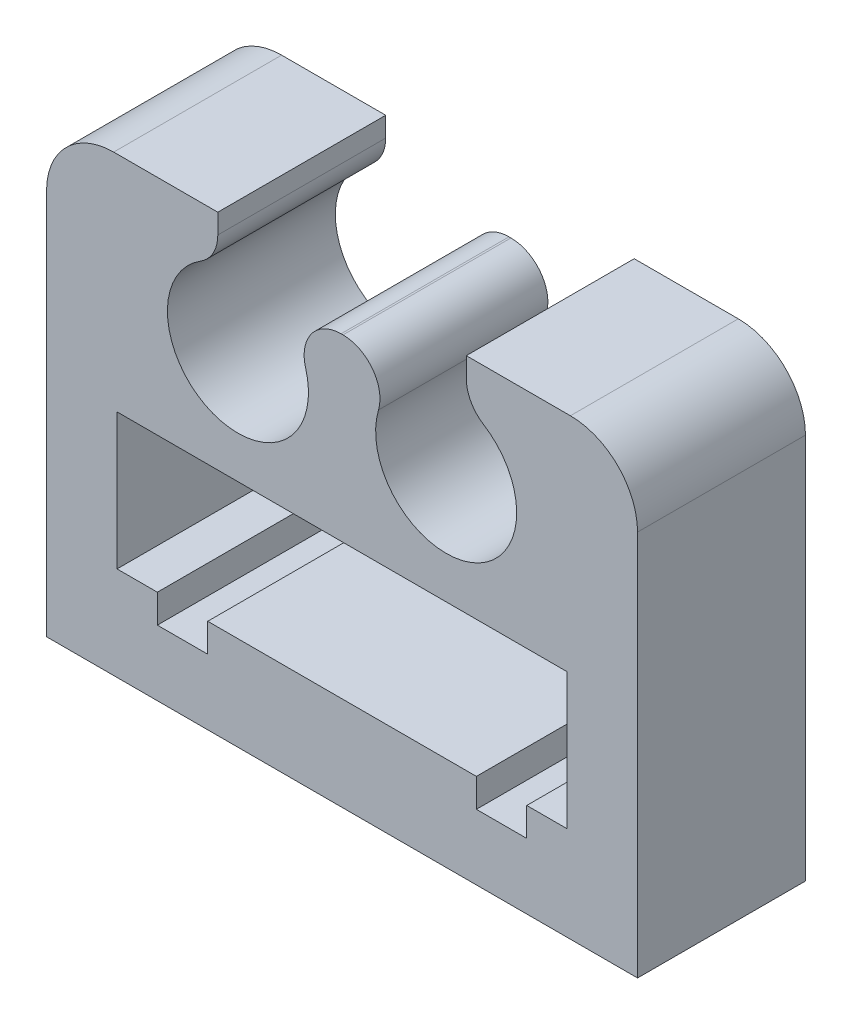
ISO-10303-21;
HEADER;
FILE_DESCRIPTION(('STEP AP214'),'2;1');
FILE_NAME('part.step','',(''),(''),'','','');
FILE_SCHEMA(('AUTOMOTIVE_DESIGN { 1 0 10303 214 1 1 1 1 }'));
ENDSEC;
DATA;
#1=APPLICATION_CONTEXT('core data for automotive mechanical design processes');
#2=APPLICATION_PROTOCOL_DEFINITION('international standard','automotive_design',2000,#1);
#3=PRODUCT_CONTEXT('',#1,'mechanical');
#4=PRODUCT('Part','Part','',(#3));
#5=PRODUCT_RELATED_PRODUCT_CATEGORY('part','',(#4));
#6=PRODUCT_DEFINITION_FORMATION('','',#4);
#7=PRODUCT_DEFINITION_CONTEXT('part definition',#1,'design');
#8=PRODUCT_DEFINITION('design','',#6,#7);
#9=PRODUCT_DEFINITION_SHAPE('','',#8);
#10=(LENGTH_UNIT() NAMED_UNIT(*) SI_UNIT(.MILLI.,.METRE.));
#11=(NAMED_UNIT(*) PLANE_ANGLE_UNIT() SI_UNIT($,.RADIAN.));
#12=(NAMED_UNIT(*) SI_UNIT($,.STERADIAN.) SOLID_ANGLE_UNIT());
#13=UNCERTAINTY_MEASURE_WITH_UNIT(LENGTH_MEASURE(1.E-05),#10,'distance_accuracy_value','');
#14=(GEOMETRIC_REPRESENTATION_CONTEXT(3) GLOBAL_UNCERTAINTY_ASSIGNED_CONTEXT((#13)) GLOBAL_UNIT_ASSIGNED_CONTEXT((#10,
#11,#12)) REPRESENTATION_CONTEXT('',''));
#15=CARTESIAN_POINT('',(0.,0.,0.));
#16=DIRECTION('',(0.,0.,1.));
#17=DIRECTION('',(1.,0.,0.));
#18=AXIS2_PLACEMENT_3D('',#15,#16,#17);
#19=CARTESIAN_POINT('',(0.,13.5,5.));
#20=DIRECTION('',(0.,-1.,0.));
#21=DIRECTION('',(0.,0.,-1.));
#22=AXIS2_PLACEMENT_3D('',#19,#20,#21);
#23=PLANE('',#22);
#24=DIRECTION('',(-1.,0.,0.));
#25=VECTOR('',#24,1.);
#26=CARTESIAN_POINT('',(0.,13.5,5.));
#27=LINE('',#26,#25);
#28=CARTESIAN_POINT('',(15.6,13.5,5.));
#29=VERTEX_POINT('',#28);
#30=CARTESIAN_POINT('',(12.5,13.5,5.));
#31=VERTEX_POINT('',#30);
#32=EDGE_CURVE('E419',#29,#31,#27,.T.);
#33=ORIENTED_EDGE('',*,*,#32,.F.);
#34=DIRECTION('',(0.,0.,-1.));
#35=VECTOR('',#34,1.);
#36=CARTESIAN_POINT('',(15.6,13.5,5.));
#37=LINE('',#36,#35);
#38=CARTESIAN_POINT('',(15.6,13.5,0.));
#39=VERTEX_POINT('',#38);
#40=EDGE_CURVE('E278',#29,#39,#37,.T.);
#41=ORIENTED_EDGE('',*,*,#40,.T.);
#42=DIRECTION('',(-1.,0.,0.));
#43=VECTOR('',#42,1.);
#44=CARTESIAN_POINT('',(0.,13.5,0.));
#45=LINE('',#44,#43);
#46=CARTESIAN_POINT('',(12.5,13.5,0.));
#47=VERTEX_POINT('',#46);
#48=EDGE_CURVE('E273',#39,#47,#45,.T.);
#49=ORIENTED_EDGE('',*,*,#48,.T.);
#50=DIRECTION('',(0.,0.,1.));
#51=VECTOR('',#50,1.);
#52=CARTESIAN_POINT('',(12.5,13.5,0.));
#53=LINE('',#52,#51);
#54=EDGE_CURVE('E276',#47,#31,#53,.T.);
#55=ORIENTED_EDGE('',*,*,#54,.T.);
#56=EDGE_LOOP('',(#33,#41,#49,#55));
#57=FACE_BOUND('',#56,.T.);
#58=ADVANCED_FACE('F87',(#57),#23,.F.);
#59=CARTESIAN_POINT('',(0.,0.,5.));
#60=DIRECTION('',(1.,0.,0.));
#61=DIRECTION('',(0.,0.,-1.));
#62=AXIS2_PLACEMENT_3D('',#59,#60,#61);
#63=PLANE('',#62);
#64=DIRECTION('',(0.,-1.,0.));
#65=VECTOR('',#64,1.);
#66=CARTESIAN_POINT('',(0.,0.,5.));
#67=LINE('',#66,#65);
#68=CARTESIAN_POINT('',(0.,11.5,5.));
#69=VERTEX_POINT('',#68);
#70=CARTESIAN_POINT('',(0.,0.,5.));
#71=VERTEX_POINT('',#70);
#72=EDGE_CURVE('E281',#69,#71,#67,.T.);
#73=ORIENTED_EDGE('',*,*,#72,.F.);
#74=DIRECTION('',(0.,0.,-1.));
#75=VECTOR('',#74,1.);
#76=CARTESIAN_POINT('',(0.,11.5,5.));
#77=LINE('',#76,#75);
#78=CARTESIAN_POINT('',(0.,11.5,0.));
#79=VERTEX_POINT('',#78);
#80=EDGE_CURVE('E95',#69,#79,#77,.T.);
#81=ORIENTED_EDGE('',*,*,#80,.T.);
#82=DIRECTION('',(0.,-1.,0.));
#83=VECTOR('',#82,1.);
#84=CARTESIAN_POINT('',(0.,0.,0.));
#85=LINE('',#84,#83);
#86=CARTESIAN_POINT('',(0.,0.,0.));
#87=VERTEX_POINT('',#86);
#88=EDGE_CURVE('E389',#79,#87,#85,.T.);
#89=ORIENTED_EDGE('',*,*,#88,.T.);
#90=DIRECTION('',(0.,0.,-1.));
#91=VECTOR('',#90,1.);
#92=CARTESIAN_POINT('',(0.,0.,5.));
#93=LINE('',#92,#91);
#94=EDGE_CURVE('E430',#71,#87,#93,.T.);
#95=ORIENTED_EDGE('',*,*,#94,.F.);
#96=EDGE_LOOP('',(#73,#81,#89,#95));
#97=FACE_BOUND('',#96,.T.);
#98=ADVANCED_FACE('F480',(#97),#63,.F.);
#99=CARTESIAN_POINT('',(0.,0.,5.));
#100=DIRECTION('',(0.,1.,0.));
#101=DIRECTION('',(0.,0.,1.));
#102=AXIS2_PLACEMENT_3D('',#99,#100,#101);
#103=PLANE('',#102);
#104=DIRECTION('',(1.,0.,0.));
#105=VECTOR('',#104,1.);
#106=CARTESIAN_POINT('',(0.,0.,0.));
#107=LINE('',#106,#105);
#108=CARTESIAN_POINT('',(17.6,0.,0.));
#109=VERTEX_POINT('',#108);
#110=EDGE_CURVE('E423',#87,#109,#107,.T.);
#111=ORIENTED_EDGE('',*,*,#110,.T.);
#112=DIRECTION('',(0.,0.,-1.));
#113=VECTOR('',#112,1.);
#114=CARTESIAN_POINT('',(17.6,0.,5.));
#115=LINE('',#114,#113);
#116=CARTESIAN_POINT('',(17.6,0.,5.));
#117=VERTEX_POINT('',#116);
#118=EDGE_CURVE('E421',#117,#109,#115,.T.);
#119=ORIENTED_EDGE('',*,*,#118,.F.);
#120=DIRECTION('',(1.,0.,0.));
#121=VECTOR('',#120,1.);
#122=CARTESIAN_POINT('',(0.,0.,5.));
#123=LINE('',#122,#121);
#124=EDGE_CURVE('E413',#71,#117,#123,.T.);
#125=ORIENTED_EDGE('',*,*,#124,.F.);
#126=ORIENTED_EDGE('',*,*,#94,.T.);
#127=EDGE_LOOP('',(#111,#119,#125,#126));
#128=FACE_BOUND('',#127,.T.);
#129=ADVANCED_FACE('F489',(#128),#103,.F.);
#130=CARTESIAN_POINT('',(17.6,0.,5.));
#131=DIRECTION('',(-1.,0.,0.));
#132=DIRECTION('',(0.,0.,1.));
#133=AXIS2_PLACEMENT_3D('',#130,#131,#132);
#134=PLANE('',#133);
#135=DIRECTION('',(0.,1.,0.));
#136=VECTOR('',#135,1.);
#137=CARTESIAN_POINT('',(17.6,0.,0.));
#138=LINE('',#137,#136);
#139=CARTESIAN_POINT('',(17.6,11.5,0.));
#140=VERTEX_POINT('',#139);
#141=EDGE_CURVE('E425',#109,#140,#138,.T.);
#142=ORIENTED_EDGE('',*,*,#141,.T.);
#143=DIRECTION('',(0.,0.,-1.));
#144=VECTOR('',#143,1.);
#145=CARTESIAN_POINT('',(17.6,11.5,5.));
#146=LINE('',#145,#144);
#147=CARTESIAN_POINT('',(17.6,11.5,5.));
#148=VERTEX_POINT('',#147);
#149=EDGE_CURVE('E472',#140,#148,#146,.F.);
#150=ORIENTED_EDGE('',*,*,#149,.T.);
#151=DIRECTION('',(0.,1.,0.));
#152=VECTOR('',#151,1.);
#153=CARTESIAN_POINT('',(17.6,0.,5.));
#154=LINE('',#153,#152);
#155=EDGE_CURVE('E415',#117,#148,#154,.T.);
#156=ORIENTED_EDGE('',*,*,#155,.F.);
#157=ORIENTED_EDGE('',*,*,#118,.T.);
#158=EDGE_LOOP('',(#142,#150,#156,#157));
#159=FACE_BOUND('',#158,.T.);
#160=ADVANCED_FACE('F498',(#159),#134,.F.);
#161=CARTESIAN_POINT('',(5.1,13.5,0.));
#162=VERTEX_POINT('',#161);
#163=CARTESIAN_POINT('',(2.,13.5,0.));
#164=VERTEX_POINT('',#163);
#165=EDGE_CURVE('E282',#162,#164,#45,.T.);
#166=ORIENTED_EDGE('',*,*,#165,.T.);
#167=DIRECTION('',(0.,0.,-1.));
#168=VECTOR('',#167,1.);
#169=CARTESIAN_POINT('',(2.,13.5,5.));
#170=LINE('',#169,#168);
#171=CARTESIAN_POINT('',(2.,13.5,5.));
#172=VERTEX_POINT('',#171);
#173=EDGE_CURVE('E12',#164,#172,#170,.F.);
#174=ORIENTED_EDGE('',*,*,#173,.T.);
#175=CARTESIAN_POINT('',(5.1,13.5,5.));
#176=VERTEX_POINT('',#175);
#177=EDGE_CURVE('E418',#176,#172,#27,.T.);
#178=ORIENTED_EDGE('',*,*,#177,.F.);
#179=DIRECTION('',(0.,0.,1.));
#180=VECTOR('',#179,1.);
#181=CARTESIAN_POINT('',(5.1,13.5,0.));
#182=LINE('',#181,#180);
#183=EDGE_CURVE('E294',#162,#176,#182,.T.);
#184=ORIENTED_EDGE('',*,*,#183,.F.);
#185=EDGE_LOOP('',(#166,#174,#178,#184));
#186=FACE_BOUND('',#185,.T.);
#187=ADVANCED_FACE('F500',(#186),#23,.F.);
#188=CARTESIAN_POINT('',(0.,0.,5.));
#189=DIRECTION('',(0.,0.,-1.));
#190=DIRECTION('',(-1.,0.,0.));
#191=AXIS2_PLACEMENT_3D('',#188,#189,#190);
#192=PLANE('',#191);
#193=ORIENTED_EDGE('',*,*,#155,.T.);
#194=CARTESIAN_POINT('',(15.6,11.5,5.));
#195=DIRECTION('',(0.,0.,-1.));
#196=DIRECTION('',(-1.,0.,0.));
#197=AXIS2_PLACEMENT_3D('',#194,#195,#196);
#198=CIRCLE('',#197,2.);
#199=EDGE_CURVE('E475',#148,#29,#198,.F.);
#200=ORIENTED_EDGE('',*,*,#199,.T.);
#201=ORIENTED_EDGE('',*,*,#32,.T.);
#202=DIRECTION('',(0.,-1.,0.));
#203=VECTOR('',#202,1.);
#204=CARTESIAN_POINT('',(12.5,13.5,5.));
#205=LINE('',#204,#203);
#206=CARTESIAN_POINT('',(12.5,12.9110883423452,5.));
#207=VERTEX_POINT('',#206);
#208=EDGE_CURVE('E292',#31,#207,#205,.T.);
#209=ORIENTED_EDGE('',*,*,#208,.T.);
#210=CARTESIAN_POINT('',(13.6,12.9110883423452,5.));
#211=DIRECTION('',(0.,0.,-1.));
#212=DIRECTION('',(-1.,0.,0.));
#213=AXIS2_PLACEMENT_3D('',#210,#211,#212);
#214=CIRCLE('',#213,1.1);
#215=CARTESIAN_POINT('',(13.015625,11.979151724664,5.));
#216=VERTEX_POINT('',#215);
#217=EDGE_CURVE('E441',#207,#216,#214,.F.);
#218=ORIENTED_EDGE('',*,*,#217,.T.);
#219=CARTESIAN_POINT('',(11.9,10.2,5.));
#220=DIRECTION('',(0.,0.,-1.));
#221=DIRECTION('',(-1.,0.,0.));
#222=AXIS2_PLACEMENT_3D('',#219,#220,#221);
#223=CIRCLE('',#222,2.1);
#224=CARTESIAN_POINT('',(9.88476748007209,10.790625,5.));
#225=VERTEX_POINT('',#224);
#226=EDGE_CURVE('E322',#216,#225,#223,.T.);
#227=ORIENTED_EDGE('',*,*,#226,.T.);
#228=CARTESIAN_POINT('',(8.82916949344318,11.1,5.));
#229=DIRECTION('',(0.,0.,-1.));
#230=DIRECTION('',(-1.,0.,0.));
#231=AXIS2_PLACEMENT_3D('',#228,#229,#230);
#232=CIRCLE('',#231,1.1);
#233=CARTESIAN_POINT('',(8.82916949344318,12.2,5.));
#234=VERTEX_POINT('',#233);
#235=EDGE_CURVE('E437',#225,#234,#232,.F.);
#236=ORIENTED_EDGE('',*,*,#235,.T.);
#237=DIRECTION('',(1.,0.,0.));
#238=VECTOR('',#237,1.);
#239=CARTESIAN_POINT('',(5.1,12.2,5.));
#240=LINE('',#239,#238);
#241=CARTESIAN_POINT('',(8.77083050655682,12.2,5.));
#242=VERTEX_POINT('',#241);
#243=EDGE_CURVE('E308',#242,#234,#240,.T.);
#244=ORIENTED_EDGE('',*,*,#243,.F.);
#245=CARTESIAN_POINT('',(8.77083050655682,11.1,5.));
#246=DIRECTION('',(0.,0.,-1.));
#247=DIRECTION('',(-1.,0.,0.));
#248=AXIS2_PLACEMENT_3D('',#245,#246,#247);
#249=CIRCLE('',#248,1.1);
#250=CARTESIAN_POINT('',(7.71523251992791,10.790625,5.));
#251=VERTEX_POINT('',#250);
#252=EDGE_CURVE('E435',#242,#251,#249,.F.);
#253=ORIENTED_EDGE('',*,*,#252,.T.);
#254=CARTESIAN_POINT('',(5.7,10.2,5.));
#255=DIRECTION('',(0.,0.,1.));
#256=DIRECTION('',(1.,0.,0.));
#257=AXIS2_PLACEMENT_3D('',#254,#255,#256);
#258=CIRCLE('',#257,2.1);
#259=CARTESIAN_POINT('',(4.584375,11.979151724664,5.));
#260=VERTEX_POINT('',#259);
#261=EDGE_CURVE('E293',#260,#251,#258,.T.);
#262=ORIENTED_EDGE('',*,*,#261,.F.);
#263=CARTESIAN_POINT('',(4.,12.9110883423452,5.));
#264=DIRECTION('',(0.,0.,-1.));
#265=DIRECTION('',(-1.,0.,0.));
#266=AXIS2_PLACEMENT_3D('',#263,#264,#265);
#267=CIRCLE('',#266,1.1);
#268=CARTESIAN_POINT('',(5.1,12.9110883423452,5.));
#269=VERTEX_POINT('',#268);
#270=EDGE_CURVE('E439',#260,#269,#267,.F.);
#271=ORIENTED_EDGE('',*,*,#270,.T.);
#272=DIRECTION('',(0.,-1.,0.));
#273=VECTOR('',#272,1.);
#274=CARTESIAN_POINT('',(5.1,13.5,5.));
#275=LINE('',#274,#273);
#276=EDGE_CURVE('E302',#176,#269,#275,.T.);
#277=ORIENTED_EDGE('',*,*,#276,.F.);
#278=ORIENTED_EDGE('',*,*,#177,.T.);
#279=CARTESIAN_POINT('',(2.,11.5,5.));
#280=DIRECTION('',(0.,0.,-1.));
#281=DIRECTION('',(-1.,0.,0.));
#282=AXIS2_PLACEMENT_3D('',#279,#280,#281);
#283=CIRCLE('',#282,2.);
#284=EDGE_CURVE('E102',#172,#69,#283,.F.);
#285=ORIENTED_EDGE('',*,*,#284,.T.);
#286=ORIENTED_EDGE('',*,*,#72,.T.);
#287=ORIENTED_EDGE('',*,*,#124,.T.);
#288=EDGE_LOOP('',(#193,#200,#201,#209,#218,#227,#236,#244,#253,#262,#271,#277,#278,#285,#286,#287));
#289=FACE_BOUND('',#288,.T.);
#290=DIRECTION('',(1.,0.,0.));
#291=VECTOR('',#290,1.);
#292=CARTESIAN_POINT('',(2.1,6.85,5.));
#293=LINE('',#292,#291);
#294=CARTESIAN_POINT('',(2.1,6.85,5.));
#295=VERTEX_POINT('',#294);
#296=CARTESIAN_POINT('',(15.5,6.85,5.));
#297=VERTEX_POINT('',#296);
#298=EDGE_CURVE('E342',#295,#297,#293,.T.);
#299=ORIENTED_EDGE('',*,*,#298,.T.);
#300=DIRECTION('',(0.,1.,0.));
#301=VECTOR('',#300,1.);
#302=CARTESIAN_POINT('',(15.5,2.8,5.));
#303=LINE('',#302,#301);
#304=CARTESIAN_POINT('',(15.5,2.8,5.));
#305=VERTEX_POINT('',#304);
#306=EDGE_CURVE('E346',#305,#297,#303,.T.);
#307=ORIENTED_EDGE('',*,*,#306,.F.);
#308=DIRECTION('',(1.,0.,0.));
#309=VECTOR('',#308,1.);
#310=CARTESIAN_POINT('',(2.1,2.8,5.));
#311=LINE('',#310,#309);
#312=CARTESIAN_POINT('',(14.3,2.8,5.));
#313=VERTEX_POINT('',#312);
#314=EDGE_CURVE('E349',#313,#305,#311,.T.);
#315=ORIENTED_EDGE('',*,*,#314,.F.);
#316=DIRECTION('',(0.,-1.,0.));
#317=VECTOR('',#316,1.);
#318=CARTESIAN_POINT('',(14.3,2.8,5.));
#319=LINE('',#318,#317);
#320=CARTESIAN_POINT('',(14.3,1.95,5.));
#321=VERTEX_POINT('',#320);
#322=EDGE_CURVE('E394',#313,#321,#319,.T.);
#323=ORIENTED_EDGE('',*,*,#322,.T.);
#324=DIRECTION('',(-1.,0.,0.));
#325=VECTOR('',#324,1.);
#326=CARTESIAN_POINT('',(14.3,1.95,5.));
#327=LINE('',#326,#325);
#328=CARTESIAN_POINT('',(12.8,1.95,5.));
#329=VERTEX_POINT('',#328);
#330=EDGE_CURVE('E402',#321,#329,#327,.T.);
#331=ORIENTED_EDGE('',*,*,#330,.T.);
#332=DIRECTION('',(0.,-1.,0.));
#333=VECTOR('',#332,1.);
#334=CARTESIAN_POINT('',(12.8,2.8,5.));
#335=LINE('',#334,#333);
#336=CARTESIAN_POINT('',(12.8,2.8,5.));
#337=VERTEX_POINT('',#336);
#338=EDGE_CURVE('E399',#337,#329,#335,.T.);
#339=ORIENTED_EDGE('',*,*,#338,.F.);
#340=CARTESIAN_POINT('',(4.8,2.8,5.));
#341=VERTEX_POINT('',#340);
#342=EDGE_CURVE('E352',#341,#337,#311,.T.);
#343=ORIENTED_EDGE('',*,*,#342,.F.);
#344=DIRECTION('',(0.,-1.,0.));
#345=VECTOR('',#344,1.);
#346=CARTESIAN_POINT('',(4.8,2.8,5.));
#347=LINE('',#346,#345);
#348=CARTESIAN_POINT('',(4.8,1.95,5.));
#349=VERTEX_POINT('',#348);
#350=EDGE_CURVE('E373',#341,#349,#347,.T.);
#351=ORIENTED_EDGE('',*,*,#350,.T.);
#352=DIRECTION('',(1.,0.,0.));
#353=VECTOR('',#352,1.);
#354=CARTESIAN_POINT('',(3.3,1.95,5.));
#355=LINE('',#354,#353);
#356=CARTESIAN_POINT('',(3.3,1.95,5.));
#357=VERTEX_POINT('',#356);
#358=EDGE_CURVE('E376',#357,#349,#355,.T.);
#359=ORIENTED_EDGE('',*,*,#358,.F.);
#360=DIRECTION('',(0.,-1.,0.));
#361=VECTOR('',#360,1.);
#362=CARTESIAN_POINT('',(3.3,2.8,5.));
#363=LINE('',#362,#361);
#364=CARTESIAN_POINT('',(3.3,2.8,5.));
#365=VERTEX_POINT('',#364);
#366=EDGE_CURVE('E366',#365,#357,#363,.T.);
#367=ORIENTED_EDGE('',*,*,#366,.F.);
#368=CARTESIAN_POINT('',(2.1,2.8,5.));
#369=VERTEX_POINT('',#368);
#370=EDGE_CURVE('E328',#369,#365,#311,.T.);
#371=ORIENTED_EDGE('',*,*,#370,.F.);
#372=DIRECTION('',(0.,1.,0.));
#373=VECTOR('',#372,1.);
#374=CARTESIAN_POINT('',(2.1,2.8,5.));
#375=LINE('',#374,#373);
#376=EDGE_CURVE('E339',#369,#295,#375,.T.);
#377=ORIENTED_EDGE('',*,*,#376,.T.);
#378=EDGE_LOOP('',(#299,#307,#315,#323,#331,#339,#343,#351,#359,#367,#371,#377));
#379=FACE_BOUND('',#378,.T.);
#380=ADVANCED_FACE('F491',(#289,#379),#192,.F.);
#381=CARTESIAN_POINT('',(0.,0.,0.));
#382=DIRECTION('',(0.,0.,-1.));
#383=DIRECTION('',(-1.,0.,0.));
#384=AXIS2_PLACEMENT_3D('',#381,#382,#383);
#385=PLANE('',#384);
#386=ORIENTED_EDGE('',*,*,#48,.F.);
#387=CARTESIAN_POINT('',(15.6,11.5,0.));
#388=DIRECTION('',(0.,0.,-1.));
#389=DIRECTION('',(-1.,0.,0.));
#390=AXIS2_PLACEMENT_3D('',#387,#388,#389);
#391=CIRCLE('',#390,2.);
#392=EDGE_CURVE('E470',#39,#140,#391,.T.);
#393=ORIENTED_EDGE('',*,*,#392,.T.);
#394=ORIENTED_EDGE('',*,*,#141,.F.);
#395=ORIENTED_EDGE('',*,*,#110,.F.);
#396=ORIENTED_EDGE('',*,*,#88,.F.);
#397=CARTESIAN_POINT('',(2.,11.5,0.));
#398=DIRECTION('',(0.,0.,-1.));
#399=DIRECTION('',(-1.,0.,0.));
#400=AXIS2_PLACEMENT_3D('',#397,#398,#399);
#401=CIRCLE('',#400,2.);
#402=EDGE_CURVE('E468',#79,#164,#401,.T.);
#403=ORIENTED_EDGE('',*,*,#402,.T.);
#404=ORIENTED_EDGE('',*,*,#165,.F.);
#405=DIRECTION('',(0.,-1.,0.));
#406=VECTOR('',#405,1.);
#407=CARTESIAN_POINT('',(5.1,13.5,0.));
#408=LINE('',#407,#406);
#409=CARTESIAN_POINT('',(5.1,12.9110883423452,0.));
#410=VERTEX_POINT('',#409);
#411=EDGE_CURVE('E305',#162,#410,#408,.T.);
#412=ORIENTED_EDGE('',*,*,#411,.T.);
#413=CARTESIAN_POINT('',(4.,12.9110883423452,0.));
#414=DIRECTION('',(0.,0.,-1.));
#415=DIRECTION('',(-1.,0.,0.));
#416=AXIS2_PLACEMENT_3D('',#413,#414,#415);
#417=CIRCLE('',#416,1.1);
#418=CARTESIAN_POINT('',(4.584375,11.979151724664,0.));
#419=VERTEX_POINT('',#418);
#420=EDGE_CURVE('E452',#410,#419,#417,.T.);
#421=ORIENTED_EDGE('',*,*,#420,.T.);
#422=CARTESIAN_POINT('',(5.7,10.2,0.));
#423=DIRECTION('',(0.,0.,1.));
#424=DIRECTION('',(1.,0.,0.));
#425=AXIS2_PLACEMENT_3D('',#422,#423,#424);
#426=CIRCLE('',#425,2.1);
#427=CARTESIAN_POINT('',(7.71523251992791,10.790625,0.));
#428=VERTEX_POINT('',#427);
#429=EDGE_CURVE('E403',#419,#428,#426,.T.);
#430=ORIENTED_EDGE('',*,*,#429,.T.);
#431=CARTESIAN_POINT('',(8.77083050655682,11.1,0.));
#432=DIRECTION('',(0.,0.,-1.));
#433=DIRECTION('',(-1.,0.,0.));
#434=AXIS2_PLACEMENT_3D('',#431,#432,#433);
#435=CIRCLE('',#434,1.1);
#436=CARTESIAN_POINT('',(8.77083050655682,12.2,0.));
#437=VERTEX_POINT('',#436);
#438=EDGE_CURVE('E448',#428,#437,#435,.T.);
#439=ORIENTED_EDGE('',*,*,#438,.T.);
#440=DIRECTION('',(1.,0.,0.));
#441=VECTOR('',#440,1.);
#442=CARTESIAN_POINT('',(5.1,12.2,0.));
#443=LINE('',#442,#441);
#444=CARTESIAN_POINT('',(8.82916949344318,12.2,0.));
#445=VERTEX_POINT('',#444);
#446=EDGE_CURVE('E301',#437,#445,#443,.T.);
#447=ORIENTED_EDGE('',*,*,#446,.T.);
#448=CARTESIAN_POINT('',(8.82916949344318,11.1,0.));
#449=DIRECTION('',(0.,0.,-1.));
#450=DIRECTION('',(-1.,0.,0.));
#451=AXIS2_PLACEMENT_3D('',#448,#449,#450);
#452=CIRCLE('',#451,1.1);
#453=CARTESIAN_POINT('',(9.88476748007209,10.790625,0.));
#454=VERTEX_POINT('',#453);
#455=EDGE_CURVE('E450',#445,#454,#452,.T.);
#456=ORIENTED_EDGE('',*,*,#455,.T.);
#457=CARTESIAN_POINT('',(11.9,10.2,0.));
#458=DIRECTION('',(0.,0.,-1.));
#459=DIRECTION('',(-1.,0.,0.));
#460=AXIS2_PLACEMENT_3D('',#457,#458,#459);
#461=CIRCLE('',#460,2.1);
#462=CARTESIAN_POINT('',(13.015625,11.979151724664,0.));
#463=VERTEX_POINT('',#462);
#464=EDGE_CURVE('E316',#463,#454,#461,.T.);
#465=ORIENTED_EDGE('',*,*,#464,.F.);
#466=CARTESIAN_POINT('',(13.6,12.9110883423452,0.));
#467=DIRECTION('',(0.,0.,-1.));
#468=DIRECTION('',(-1.,0.,0.));
#469=AXIS2_PLACEMENT_3D('',#466,#467,#468);
#470=CIRCLE('',#469,1.1);
#471=CARTESIAN_POINT('',(12.5,12.9110883423452,0.));
#472=VERTEX_POINT('',#471);
#473=EDGE_CURVE('E300',#463,#472,#470,.T.);
#474=ORIENTED_EDGE('',*,*,#473,.T.);
#475=DIRECTION('',(0.,-1.,0.));
#476=VECTOR('',#475,1.);
#477=CARTESIAN_POINT('',(12.5,13.5,0.));
#478=LINE('',#477,#476);
#479=EDGE_CURVE('E289',#47,#472,#478,.T.);
#480=ORIENTED_EDGE('',*,*,#479,.F.);
#481=EDGE_LOOP('',(#386,#393,#394,#395,#396,#403,#404,#412,#421,#430,#439,#447,#456,#465,#474,#480));
#482=FACE_BOUND('',#481,.T.);
#483=DIRECTION('',(0.,1.,0.));
#484=VECTOR('',#483,1.);
#485=CARTESIAN_POINT('',(15.5,2.8,0.));
#486=LINE('',#485,#484);
#487=CARTESIAN_POINT('',(15.5,2.8,0.));
#488=VERTEX_POINT('',#487);
#489=CARTESIAN_POINT('',(15.5,6.85,0.));
#490=VERTEX_POINT('',#489);
#491=EDGE_CURVE('E330',#488,#490,#486,.T.);
#492=ORIENTED_EDGE('',*,*,#491,.T.);
#493=DIRECTION('',(1.,0.,0.));
#494=VECTOR('',#493,1.);
#495=CARTESIAN_POINT('',(2.1,6.85,0.));
#496=LINE('',#495,#494);
#497=CARTESIAN_POINT('',(2.1,6.85,0.));
#498=VERTEX_POINT('',#497);
#499=EDGE_CURVE('E327',#498,#490,#496,.T.);
#500=ORIENTED_EDGE('',*,*,#499,.F.);
#501=DIRECTION('',(0.,1.,0.));
#502=VECTOR('',#501,1.);
#503=CARTESIAN_POINT('',(2.1,2.8,0.));
#504=LINE('',#503,#502);
#505=CARTESIAN_POINT('',(2.1,2.8,0.));
#506=VERTEX_POINT('',#505);
#507=EDGE_CURVE('E325',#506,#498,#504,.T.);
#508=ORIENTED_EDGE('',*,*,#507,.F.);
#509=DIRECTION('',(1.,0.,0.));
#510=VECTOR('',#509,1.);
#511=CARTESIAN_POINT('',(2.1,2.8,0.));
#512=LINE('',#511,#510);
#513=CARTESIAN_POINT('',(3.3,2.8,0.));
#514=VERTEX_POINT('',#513);
#515=EDGE_CURVE('E334',#506,#514,#512,.T.);
#516=ORIENTED_EDGE('',*,*,#515,.T.);
#517=DIRECTION('',(0.,-1.,0.));
#518=VECTOR('',#517,1.);
#519=CARTESIAN_POINT('',(3.3,2.8,0.));
#520=LINE('',#519,#518);
#521=CARTESIAN_POINT('',(3.3,1.95,0.));
#522=VERTEX_POINT('',#521);
#523=EDGE_CURVE('E369',#514,#522,#520,.T.);
#524=ORIENTED_EDGE('',*,*,#523,.T.);
#525=DIRECTION('',(1.,0.,0.));
#526=VECTOR('',#525,1.);
#527=CARTESIAN_POINT('',(3.3,1.95,0.));
#528=LINE('',#527,#526);
#529=CARTESIAN_POINT('',(4.8,1.95,0.));
#530=VERTEX_POINT('',#529);
#531=EDGE_CURVE('E365',#522,#530,#528,.T.);
#532=ORIENTED_EDGE('',*,*,#531,.T.);
#533=DIRECTION('',(0.,-1.,0.));
#534=VECTOR('',#533,1.);
#535=CARTESIAN_POINT('',(4.8,2.8,0.));
#536=LINE('',#535,#534);
#537=CARTESIAN_POINT('',(4.8,2.8,0.));
#538=VERTEX_POINT('',#537);
#539=EDGE_CURVE('E363',#538,#530,#536,.T.);
#540=ORIENTED_EDGE('',*,*,#539,.F.);
#541=CARTESIAN_POINT('',(12.8,2.8,0.));
#542=VERTEX_POINT('',#541);
#543=EDGE_CURVE('E338',#538,#542,#512,.T.);
#544=ORIENTED_EDGE('',*,*,#543,.T.);
#545=DIRECTION('',(0.,-1.,0.));
#546=VECTOR('',#545,1.);
#547=CARTESIAN_POINT('',(12.8,2.8,0.));
#548=LINE('',#547,#546);
#549=CARTESIAN_POINT('',(12.8,1.95,0.));
#550=VERTEX_POINT('',#549);
#551=EDGE_CURVE('E390',#542,#550,#548,.T.);
#552=ORIENTED_EDGE('',*,*,#551,.T.);
#553=DIRECTION('',(-1.,0.,0.));
#554=VECTOR('',#553,1.);
#555=CARTESIAN_POINT('',(14.3,1.95,0.));
#556=LINE('',#555,#554);
#557=CARTESIAN_POINT('',(14.3,1.95,0.));
#558=VERTEX_POINT('',#557);
#559=EDGE_CURVE('E393',#558,#550,#556,.T.);
#560=ORIENTED_EDGE('',*,*,#559,.F.);
#561=DIRECTION('',(0.,-1.,0.));
#562=VECTOR('',#561,1.);
#563=CARTESIAN_POINT('',(14.3,2.8,0.));
#564=LINE('',#563,#562);
#565=CARTESIAN_POINT('',(14.3,2.8,0.));
#566=VERTEX_POINT('',#565);
#567=EDGE_CURVE('E396',#566,#558,#564,.T.);
#568=ORIENTED_EDGE('',*,*,#567,.F.);
#569=EDGE_CURVE('E333',#566,#488,#512,.T.);
#570=ORIENTED_EDGE('',*,*,#569,.T.);
#571=EDGE_LOOP('',(#492,#500,#508,#516,#524,#532,#540,#544,#552,#560,#568,#570));
#572=FACE_BOUND('',#571,.T.);
#573=ADVANCED_FACE('F296',(#482,#572),#385,.T.);
#574=CARTESIAN_POINT('',(2.1,6.85,0.));
#575=DIRECTION('',(0.,-1.,0.));
#576=DIRECTION('',(0.,0.,-1.));
#577=AXIS2_PLACEMENT_3D('',#574,#575,#576);
#578=PLANE('',#577);
#579=ORIENTED_EDGE('',*,*,#298,.F.);
#580=DIRECTION('',(0.,0.,1.));
#581=VECTOR('',#580,1.);
#582=CARTESIAN_POINT('',(2.1,6.85,0.));
#583=LINE('',#582,#581);
#584=EDGE_CURVE('E359',#498,#295,#583,.T.);
#585=ORIENTED_EDGE('',*,*,#584,.F.);
#586=ORIENTED_EDGE('',*,*,#499,.T.);
#587=DIRECTION('',(0.,0.,1.));
#588=VECTOR('',#587,1.);
#589=CARTESIAN_POINT('',(15.5,6.85,0.));
#590=LINE('',#589,#588);
#591=EDGE_CURVE('E357',#490,#297,#590,.T.);
#592=ORIENTED_EDGE('',*,*,#591,.T.);
#593=EDGE_LOOP('',(#579,#585,#586,#592));
#594=FACE_BOUND('',#593,.T.);
#595=ADVANCED_FACE('F516',(#594),#578,.T.);
#596=CARTESIAN_POINT('',(2.1,2.8,0.));
#597=DIRECTION('',(1.,0.,0.));
#598=DIRECTION('',(0.,0.,-1.));
#599=AXIS2_PLACEMENT_3D('',#596,#597,#598);
#600=PLANE('',#599);
#601=ORIENTED_EDGE('',*,*,#376,.F.);
#602=DIRECTION('',(0.,0.,1.));
#603=VECTOR('',#602,1.);
#604=CARTESIAN_POINT('',(2.1,2.8,0.));
#605=LINE('',#604,#603);
#606=EDGE_CURVE('E337',#506,#369,#605,.T.);
#607=ORIENTED_EDGE('',*,*,#606,.F.);
#608=ORIENTED_EDGE('',*,*,#507,.T.);
#609=ORIENTED_EDGE('',*,*,#584,.T.);
#610=EDGE_LOOP('',(#601,#607,#608,#609));
#611=FACE_BOUND('',#610,.T.);
#612=ADVANCED_FACE('F545',(#611),#600,.T.);
#613=CARTESIAN_POINT('',(15.5,2.8,0.));
#614=DIRECTION('',(1.,0.,0.));
#615=DIRECTION('',(0.,0.,-1.));
#616=AXIS2_PLACEMENT_3D('',#613,#614,#615);
#617=PLANE('',#616);
#618=ORIENTED_EDGE('',*,*,#306,.T.);
#619=ORIENTED_EDGE('',*,*,#591,.F.);
#620=ORIENTED_EDGE('',*,*,#491,.F.);
#621=DIRECTION('',(0.,0.,1.));
#622=VECTOR('',#621,1.);
#623=CARTESIAN_POINT('',(15.5,2.8,0.));
#624=LINE('',#623,#622);
#625=EDGE_CURVE('E354',#488,#305,#624,.T.);
#626=ORIENTED_EDGE('',*,*,#625,.T.);
#627=EDGE_LOOP('',(#618,#619,#620,#626));
#628=FACE_BOUND('',#627,.T.);
#629=ADVANCED_FACE('F548',(#628),#617,.F.);
#630=CARTESIAN_POINT('',(2.1,2.8,0.));
#631=DIRECTION('',(0.,-1.,0.));
#632=DIRECTION('',(0.,0.,-1.));
#633=AXIS2_PLACEMENT_3D('',#630,#631,#632);
#634=PLANE('',#633);
#635=DIRECTION('',(0.,0.,1.));
#636=VECTOR('',#635,1.);
#637=CARTESIAN_POINT('',(4.8,2.8,0.));
#638=LINE('',#637,#636);
#639=EDGE_CURVE('E383',#538,#341,#638,.T.);
#640=ORIENTED_EDGE('',*,*,#639,.T.);
#641=ORIENTED_EDGE('',*,*,#342,.T.);
#642=DIRECTION('',(0.,0.,1.));
#643=VECTOR('',#642,1.);
#644=CARTESIAN_POINT('',(12.8,2.8,0.));
#645=LINE('',#644,#643);
#646=EDGE_CURVE('E362',#542,#337,#645,.T.);
#647=ORIENTED_EDGE('',*,*,#646,.F.);
#648=ORIENTED_EDGE('',*,*,#543,.F.);
#649=EDGE_LOOP('',(#640,#641,#647,#648));
#650=FACE_BOUND('',#649,.T.);
#651=ADVANCED_FACE('F555',(#650),#634,.F.);
#652=DIRECTION('',(0.,0.,1.));
#653=VECTOR('',#652,1.);
#654=CARTESIAN_POINT('',(14.3,2.8,0.));
#655=LINE('',#654,#653);
#656=EDGE_CURVE('E384',#566,#313,#655,.T.);
#657=ORIENTED_EDGE('',*,*,#656,.T.);
#658=ORIENTED_EDGE('',*,*,#314,.T.);
#659=ORIENTED_EDGE('',*,*,#625,.F.);
#660=ORIENTED_EDGE('',*,*,#569,.F.);
#661=EDGE_LOOP('',(#657,#658,#659,#660));
#662=FACE_BOUND('',#661,.T.);
#663=ADVANCED_FACE('F557',(#662),#634,.F.);
#664=ORIENTED_EDGE('',*,*,#515,.F.);
#665=ORIENTED_EDGE('',*,*,#606,.T.);
#666=ORIENTED_EDGE('',*,*,#370,.T.);
#667=DIRECTION('',(0.,0.,1.));
#668=VECTOR('',#667,1.);
#669=CARTESIAN_POINT('',(3.3,2.8,0.));
#670=LINE('',#669,#668);
#671=EDGE_CURVE('E381',#514,#365,#670,.T.);
#672=ORIENTED_EDGE('',*,*,#671,.F.);
#673=EDGE_LOOP('',(#664,#665,#666,#672));
#674=FACE_BOUND('',#673,.T.);
#675=ADVANCED_FACE('F528',(#674),#634,.F.);
#676=CARTESIAN_POINT('',(14.3,1.95,0.));
#677=DIRECTION('',(0.,1.,0.));
#678=DIRECTION('',(-1.,0.,0.));
#679=AXIS2_PLACEMENT_3D('',#676,#677,#678);
#680=PLANE('',#679);
#681=ORIENTED_EDGE('',*,*,#330,.F.);
#682=DIRECTION('',(0.,0.,1.));
#683=VECTOR('',#682,1.);
#684=CARTESIAN_POINT('',(14.3,1.95,0.));
#685=LINE('',#684,#683);
#686=EDGE_CURVE('E377',#558,#321,#685,.T.);
#687=ORIENTED_EDGE('',*,*,#686,.F.);
#688=ORIENTED_EDGE('',*,*,#559,.T.);
#689=DIRECTION('',(0.,0.,1.));
#690=VECTOR('',#689,1.);
#691=CARTESIAN_POINT('',(12.8,1.95,0.));
#692=LINE('',#691,#690);
#693=EDGE_CURVE('E398',#550,#329,#692,.T.);
#694=ORIENTED_EDGE('',*,*,#693,.T.);
#695=EDGE_LOOP('',(#681,#687,#688,#694));
#696=FACE_BOUND('',#695,.T.);
#697=ADVANCED_FACE('F523',(#696),#680,.T.);
#698=CARTESIAN_POINT('',(12.8,2.8,0.));
#699=DIRECTION('',(-1.,0.,0.));
#700=DIRECTION('',(0.,0.,1.));
#701=AXIS2_PLACEMENT_3D('',#698,#699,#700);
#702=PLANE('',#701);
#703=ORIENTED_EDGE('',*,*,#338,.T.);
#704=ORIENTED_EDGE('',*,*,#693,.F.);
#705=ORIENTED_EDGE('',*,*,#551,.F.);
#706=ORIENTED_EDGE('',*,*,#646,.T.);
#707=EDGE_LOOP('',(#703,#704,#705,#706));
#708=FACE_BOUND('',#707,.T.);
#709=ADVANCED_FACE('F519',(#708),#702,.F.);
#710=CARTESIAN_POINT('',(14.3,2.8,0.));
#711=DIRECTION('',(-1.,0.,0.));
#712=DIRECTION('',(0.,0.,1.));
#713=AXIS2_PLACEMENT_3D('',#710,#711,#712);
#714=PLANE('',#713);
#715=ORIENTED_EDGE('',*,*,#322,.F.);
#716=ORIENTED_EDGE('',*,*,#656,.F.);
#717=ORIENTED_EDGE('',*,*,#567,.T.);
#718=ORIENTED_EDGE('',*,*,#686,.T.);
#719=EDGE_LOOP('',(#715,#716,#717,#718));
#720=FACE_BOUND('',#719,.T.);
#721=ADVANCED_FACE('F522',(#720),#714,.T.);
#722=CARTESIAN_POINT('',(3.3,1.95,0.));
#723=DIRECTION('',(0.,-1.,0.));
#724=DIRECTION('',(0.,0.,-1.));
#725=AXIS2_PLACEMENT_3D('',#722,#723,#724);
#726=PLANE('',#725);
#727=ORIENTED_EDGE('',*,*,#358,.T.);
#728=DIRECTION('',(0.,0.,1.));
#729=VECTOR('',#728,1.);
#730=CARTESIAN_POINT('',(4.8,1.95,0.));
#731=LINE('',#730,#729);
#732=EDGE_CURVE('E343',#530,#349,#731,.T.);
#733=ORIENTED_EDGE('',*,*,#732,.F.);
#734=ORIENTED_EDGE('',*,*,#531,.F.);
#735=DIRECTION('',(0.,0.,1.));
#736=VECTOR('',#735,1.);
#737=CARTESIAN_POINT('',(3.3,1.95,0.));
#738=LINE('',#737,#736);
#739=EDGE_CURVE('E372',#522,#357,#738,.T.);
#740=ORIENTED_EDGE('',*,*,#739,.T.);
#741=EDGE_LOOP('',(#727,#733,#734,#740));
#742=FACE_BOUND('',#741,.T.);
#743=ADVANCED_FACE('F532',(#742),#726,.F.);
#744=CARTESIAN_POINT('',(3.3,2.8,0.));
#745=DIRECTION('',(-1.,0.,0.));
#746=DIRECTION('',(0.,0.,1.));
#747=AXIS2_PLACEMENT_3D('',#744,#745,#746);
#748=PLANE('',#747);
#749=ORIENTED_EDGE('',*,*,#366,.T.);
#750=ORIENTED_EDGE('',*,*,#739,.F.);
#751=ORIENTED_EDGE('',*,*,#523,.F.);
#752=ORIENTED_EDGE('',*,*,#671,.T.);
#753=EDGE_LOOP('',(#749,#750,#751,#752));
#754=FACE_BOUND('',#753,.T.);
#755=ADVANCED_FACE('F537',(#754),#748,.F.);
#756=CARTESIAN_POINT('',(4.8,2.8,0.));
#757=DIRECTION('',(-1.,0.,0.));
#758=DIRECTION('',(0.,0.,1.));
#759=AXIS2_PLACEMENT_3D('',#756,#757,#758);
#760=PLANE('',#759);
#761=ORIENTED_EDGE('',*,*,#350,.F.);
#762=ORIENTED_EDGE('',*,*,#639,.F.);
#763=ORIENTED_EDGE('',*,*,#539,.T.);
#764=ORIENTED_EDGE('',*,*,#732,.T.);
#765=EDGE_LOOP('',(#761,#762,#763,#764));
#766=FACE_BOUND('',#765,.T.);
#767=ADVANCED_FACE('F525',(#766),#760,.T.);
#768=CARTESIAN_POINT('',(5.7,10.2,0.));
#769=DIRECTION('',(0.,0.,1.));
#770=DIRECTION('',(1.,0.,0.));
#771=AXIS2_PLACEMENT_3D('',#768,#769,#770);
#772=CYLINDRICAL_SURFACE('',#771,2.1);
#773=ORIENTED_EDGE('',*,*,#429,.F.);
#774=DIRECTION('',(0.,0.,1.));
#775=VECTOR('',#774,1.);
#776=CARTESIAN_POINT('',(4.584375,11.979151724664,0.));
#777=LINE('',#776,#775);
#778=EDGE_CURVE('E458',#419,#260,#777,.T.);
#779=ORIENTED_EDGE('',*,*,#778,.T.);
#780=ORIENTED_EDGE('',*,*,#261,.T.);
#781=DIRECTION('',(0.,0.,1.));
#782=VECTOR('',#781,1.);
#783=CARTESIAN_POINT('',(7.71523251992791,10.790625,0.));
#784=LINE('',#783,#782);
#785=EDGE_CURVE('E455',#251,#428,#784,.F.);
#786=ORIENTED_EDGE('',*,*,#785,.T.);
#787=EDGE_LOOP('',(#773,#779,#780,#786));
#788=FACE_BOUND('',#787,.T.);
#789=ADVANCED_FACE('F536',(#788),#772,.F.);
#790=CARTESIAN_POINT('',(11.9,10.2,0.));
#791=DIRECTION('',(0.,0.,1.));
#792=DIRECTION('',(1.,0.,0.));
#793=AXIS2_PLACEMENT_3D('',#790,#791,#792);
#794=CYLINDRICAL_SURFACE('',#793,2.1);
#795=ORIENTED_EDGE('',*,*,#226,.F.);
#796=DIRECTION('',(0.,0.,1.));
#797=VECTOR('',#796,1.);
#798=CARTESIAN_POINT('',(13.015625,11.979151724664,0.));
#799=LINE('',#798,#797);
#800=EDGE_CURVE('E446',#216,#463,#799,.F.);
#801=ORIENTED_EDGE('',*,*,#800,.T.);
#802=ORIENTED_EDGE('',*,*,#464,.T.);
#803=DIRECTION('',(0.,0.,1.));
#804=VECTOR('',#803,1.);
#805=CARTESIAN_POINT('',(9.88476748007209,10.790625,0.));
#806=LINE('',#805,#804);
#807=EDGE_CURVE('E443',#454,#225,#806,.T.);
#808=ORIENTED_EDGE('',*,*,#807,.T.);
#809=EDGE_LOOP('',(#795,#801,#802,#808));
#810=FACE_BOUND('',#809,.T.);
#811=ADVANCED_FACE('F561',(#810),#794,.F.);
#812=CARTESIAN_POINT('',(5.1,13.5,0.));
#813=DIRECTION('',(-1.,0.,0.));
#814=DIRECTION('',(0.,0.,1.));
#815=AXIS2_PLACEMENT_3D('',#812,#813,#814);
#816=PLANE('',#815);
#817=ORIENTED_EDGE('',*,*,#276,.T.);
#818=DIRECTION('',(0.,0.,1.));
#819=VECTOR('',#818,1.);
#820=CARTESIAN_POINT('',(5.1,12.9110883423452,0.));
#821=LINE('',#820,#819);
#822=EDGE_CURVE('E461',#269,#410,#821,.F.);
#823=ORIENTED_EDGE('',*,*,#822,.T.);
#824=ORIENTED_EDGE('',*,*,#411,.F.);
#825=ORIENTED_EDGE('',*,*,#183,.T.);
#826=EDGE_LOOP('',(#817,#823,#824,#825));
#827=FACE_BOUND('',#826,.T.);
#828=ADVANCED_FACE('F564',(#827),#816,.F.);
#829=CARTESIAN_POINT('',(12.5,13.5,0.));
#830=DIRECTION('',(-1.,0.,0.));
#831=DIRECTION('',(0.,0.,1.));
#832=AXIS2_PLACEMENT_3D('',#829,#830,#831);
#833=PLANE('',#832);
#834=ORIENTED_EDGE('',*,*,#479,.T.);
#835=DIRECTION('',(0.,0.,1.));
#836=VECTOR('',#835,1.);
#837=CARTESIAN_POINT('',(12.5,12.9110883423452,0.));
#838=LINE('',#837,#836);
#839=EDGE_CURVE('E433',#472,#207,#838,.T.);
#840=ORIENTED_EDGE('',*,*,#839,.T.);
#841=ORIENTED_EDGE('',*,*,#208,.F.);
#842=ORIENTED_EDGE('',*,*,#54,.F.);
#843=EDGE_LOOP('',(#834,#840,#841,#842));
#844=FACE_BOUND('',#843,.T.);
#845=ADVANCED_FACE('F287',(#844),#833,.T.);
#846=CARTESIAN_POINT('',(5.1,12.2,0.));
#847=DIRECTION('',(0.,-1.,0.));
#848=DIRECTION('',(1.,0.,0.));
#849=AXIS2_PLACEMENT_3D('',#846,#847,#848);
#850=PLANE('',#849);
#851=ORIENTED_EDGE('',*,*,#243,.T.);
#852=DIRECTION('',(0.,0.,-1.));
#853=VECTOR('',#852,1.);
#854=CARTESIAN_POINT('',(8.82916949344318,12.2,0.));
#855=LINE('',#854,#853);
#856=EDGE_CURVE('E465',#234,#445,#855,.T.);
#857=ORIENTED_EDGE('',*,*,#856,.T.);
#858=ORIENTED_EDGE('',*,*,#446,.F.);
#859=DIRECTION('',(0.,0.,1.));
#860=VECTOR('',#859,1.);
#861=CARTESIAN_POINT('',(8.77083050655682,12.2,0.));
#862=LINE('',#861,#860);
#863=EDGE_CURVE('E463',#437,#242,#862,.T.);
#864=ORIENTED_EDGE('',*,*,#863,.T.);
#865=EDGE_LOOP('',(#851,#857,#858,#864));
#866=FACE_BOUND('',#865,.T.);
#867=ADVANCED_FACE('F569',(#866),#850,.F.);
#868=CARTESIAN_POINT('',(13.6,12.9110883423452,0.));
#869=DIRECTION('',(0.,0.,1.));
#870=DIRECTION('',(1.,0.,0.));
#871=AXIS2_PLACEMENT_3D('',#868,#869,#870);
#872=CYLINDRICAL_SURFACE('',#871,1.1);
#873=ORIENTED_EDGE('',*,*,#473,.F.);
#874=ORIENTED_EDGE('',*,*,#800,.F.);
#875=ORIENTED_EDGE('',*,*,#217,.F.);
#876=ORIENTED_EDGE('',*,*,#839,.F.);
#877=EDGE_LOOP('',(#873,#874,#875,#876));
#878=FACE_BOUND('',#877,.T.);
#879=ADVANCED_FACE('F566',(#878),#872,.T.);
#880=CARTESIAN_POINT('',(4.,12.9110883423452,0.));
#881=DIRECTION('',(0.,0.,1.));
#882=DIRECTION('',(1.,0.,0.));
#883=AXIS2_PLACEMENT_3D('',#880,#881,#882);
#884=CYLINDRICAL_SURFACE('',#883,1.1);
#885=ORIENTED_EDGE('',*,*,#420,.F.);
#886=ORIENTED_EDGE('',*,*,#822,.F.);
#887=ORIENTED_EDGE('',*,*,#270,.F.);
#888=ORIENTED_EDGE('',*,*,#778,.F.);
#889=EDGE_LOOP('',(#885,#886,#887,#888));
#890=FACE_BOUND('',#889,.T.);
#891=ADVANCED_FACE('F588',(#890),#884,.T.);
#892=CARTESIAN_POINT('',(8.82916949344318,11.1,0.));
#893=DIRECTION('',(0.,0.,1.));
#894=DIRECTION('',(1.,0.,0.));
#895=AXIS2_PLACEMENT_3D('',#892,#893,#894);
#896=CYLINDRICAL_SURFACE('',#895,1.1);
#897=ORIENTED_EDGE('',*,*,#455,.F.);
#898=ORIENTED_EDGE('',*,*,#856,.F.);
#899=ORIENTED_EDGE('',*,*,#235,.F.);
#900=ORIENTED_EDGE('',*,*,#807,.F.);
#901=EDGE_LOOP('',(#897,#898,#899,#900));
#902=FACE_BOUND('',#901,.T.);
#903=ADVANCED_FACE('F600',(#902),#896,.T.);
#904=CARTESIAN_POINT('',(8.77083050655682,11.1,0.));
#905=DIRECTION('',(0.,0.,1.));
#906=DIRECTION('',(1.,0.,0.));
#907=AXIS2_PLACEMENT_3D('',#904,#905,#906);
#908=CYLINDRICAL_SURFACE('',#907,1.1);
#909=ORIENTED_EDGE('',*,*,#252,.F.);
#910=ORIENTED_EDGE('',*,*,#863,.F.);
#911=ORIENTED_EDGE('',*,*,#438,.F.);
#912=ORIENTED_EDGE('',*,*,#785,.F.);
#913=EDGE_LOOP('',(#909,#910,#911,#912));
#914=FACE_BOUND('',#913,.T.);
#915=ADVANCED_FACE('F596',(#914),#908,.T.);
#916=CARTESIAN_POINT('',(15.6,11.5,5.));
#917=DIRECTION('',(0.,0.,-1.));
#918=DIRECTION('',(-1.,0.,0.));
#919=AXIS2_PLACEMENT_3D('',#916,#917,#918);
#920=CYLINDRICAL_SURFACE('',#919,2.);
#921=ORIENTED_EDGE('',*,*,#199,.F.);
#922=ORIENTED_EDGE('',*,*,#149,.F.);
#923=ORIENTED_EDGE('',*,*,#392,.F.);
#924=ORIENTED_EDGE('',*,*,#40,.F.);
#925=EDGE_LOOP('',(#921,#922,#923,#924));
#926=FACE_BOUND('',#925,.T.);
#927=ADVANCED_FACE('F497',(#926),#920,.T.);
#928=CARTESIAN_POINT('',(2.,11.5,5.));
#929=DIRECTION('',(0.,0.,-1.));
#930=DIRECTION('',(-1.,0.,0.));
#931=AXIS2_PLACEMENT_3D('',#928,#929,#930);
#932=CYLINDRICAL_SURFACE('',#931,2.);
#933=ORIENTED_EDGE('',*,*,#284,.F.);
#934=ORIENTED_EDGE('',*,*,#173,.F.);
#935=ORIENTED_EDGE('',*,*,#402,.F.);
#936=ORIENTED_EDGE('',*,*,#80,.F.);
#937=EDGE_LOOP('',(#933,#934,#935,#936));
#938=FACE_BOUND('',#937,.T.);
#939=ADVANCED_FACE('F89',(#938),#932,.T.);
#940=CLOSED_SHELL('',(#58,#98,#129,#160,#187,#380,#573,#595,#612,#629,#651,#663,#675,#697,#709,
#721,#743,#755,#767,#789,#811,#828,#845,#867,#879,#891,#903,#915,#927,#939));
#941=MANIFOLD_SOLID_BREP('B2',#940);
#942=ADVANCED_BREP_SHAPE_REPRESENTATION('',(#18,#941),#14);
#943=SHAPE_DEFINITION_REPRESENTATION(#9,#942);
ENDSEC;
END-ISO-10303-21;
